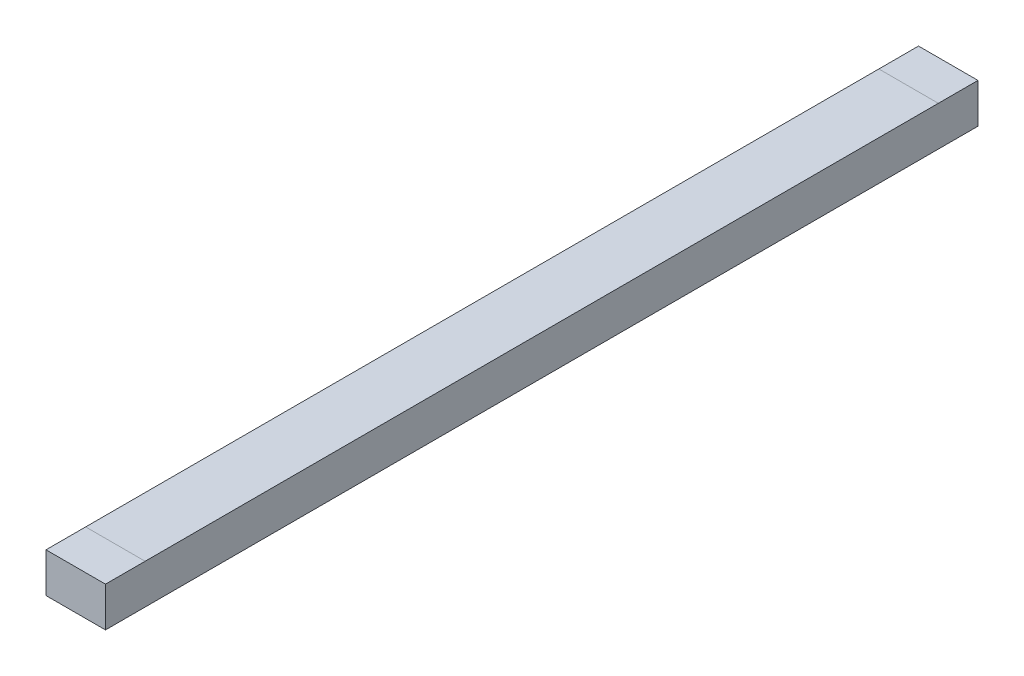
ISO-10303-21;
HEADER;
FILE_DESCRIPTION(('STEP AP214'),'2;1');
FILE_NAME('part.step','',(''),(''),'','','');
FILE_SCHEMA(('AUTOMOTIVE_DESIGN { 1 0 10303 214 1 1 1 1 }'));
ENDSEC;
DATA;
#1=APPLICATION_CONTEXT('core data for automotive mechanical design processes');
#2=APPLICATION_PROTOCOL_DEFINITION('international standard','automotive_design',2000,#1);
#3=PRODUCT_CONTEXT('',#1,'mechanical');
#4=PRODUCT('Part','Part','',(#3));
#5=PRODUCT_RELATED_PRODUCT_CATEGORY('part','',(#4));
#6=PRODUCT_DEFINITION_FORMATION('','',#4);
#7=PRODUCT_DEFINITION_CONTEXT('part definition',#1,'design');
#8=PRODUCT_DEFINITION('design','',#6,#7);
#9=PRODUCT_DEFINITION_SHAPE('','',#8);
#10=(LENGTH_UNIT() NAMED_UNIT(*) SI_UNIT(.MILLI.,.METRE.));
#11=(NAMED_UNIT(*) PLANE_ANGLE_UNIT() SI_UNIT($,.RADIAN.));
#12=(NAMED_UNIT(*) SI_UNIT($,.STERADIAN.) SOLID_ANGLE_UNIT());
#13=UNCERTAINTY_MEASURE_WITH_UNIT(LENGTH_MEASURE(1.E-05),#10,'distance_accuracy_value','');
#14=(GEOMETRIC_REPRESENTATION_CONTEXT(3) GLOBAL_UNCERTAINTY_ASSIGNED_CONTEXT((#13)) GLOBAL_UNIT_ASSIGNED_CONTEXT((#10,
#11,#12)) REPRESENTATION_CONTEXT('',''));
#15=CARTESIAN_POINT('',(0.,0.,0.));
#16=DIRECTION('',(0.,0.,1.));
#17=DIRECTION('',(1.,0.,0.));
#18=AXIS2_PLACEMENT_3D('',#15,#16,#17);
#19=CARTESIAN_POINT('',(0.,0.,2200.));
#20=DIRECTION('',(0.,1.,0.));
#21=DIRECTION('',(0.,0.,1.));
#22=AXIS2_PLACEMENT_3D('',#19,#20,#21);
#23=PLANE('',#22);
#24=DIRECTION('',(-1.,0.,0.));
#25=VECTOR('',#24,1.);
#26=CARTESIAN_POINT('',(0.,0.,2100.));
#27=LINE('',#26,#25);
#28=CARTESIAN_POINT('',(150.,0.,2100.));
#29=VERTEX_POINT('',#28);
#30=CARTESIAN_POINT('',(0.,0.,2100.));
#31=VERTEX_POINT('',#30);
#32=EDGE_CURVE('E12',#29,#31,#27,.T.);
#33=ORIENTED_EDGE('',*,*,#32,.F.);
#34=DIRECTION('',(0.,0.,-1.));
#35=VECTOR('',#34,1.);
#36=CARTESIAN_POINT('',(150.,0.,2200.));
#37=LINE('',#36,#35);
#38=CARTESIAN_POINT('',(150.,0.,2200.));
#39=VERTEX_POINT('',#38);
#40=EDGE_CURVE('E117',#39,#29,#37,.T.);
#41=ORIENTED_EDGE('',*,*,#40,.F.);
#42=DIRECTION('',(1.,0.,0.));
#43=VECTOR('',#42,1.);
#44=CARTESIAN_POINT('',(0.,0.,2200.));
#45=LINE('',#44,#43);
#46=CARTESIAN_POINT('',(0.,0.,2200.));
#47=VERTEX_POINT('',#46);
#48=EDGE_CURVE('E112',#47,#39,#45,.T.);
#49=ORIENTED_EDGE('',*,*,#48,.F.);
#50=DIRECTION('',(0.,0.,-1.));
#51=VECTOR('',#50,1.);
#52=CARTESIAN_POINT('',(0.,0.,2200.));
#53=LINE('',#52,#51);
#54=EDGE_CURVE('E115',#47,#31,#53,.T.);
#55=ORIENTED_EDGE('',*,*,#54,.T.);
#56=EDGE_LOOP('',(#33,#41,#49,#55));
#57=FACE_BOUND('',#56,.T.);
#58=ADVANCED_FACE('F52',(#57),#23,.F.);
#59=CARTESIAN_POINT('',(0.,100.,2200.));
#60=DIRECTION('',(0.,-1.,0.));
#61=DIRECTION('',(0.,0.,-1.));
#62=AXIS2_PLACEMENT_3D('',#59,#60,#61);
#63=PLANE('',#62);
#64=DIRECTION('',(1.,0.,0.));
#65=VECTOR('',#64,1.);
#66=CARTESIAN_POINT('',(0.,100.,2100.));
#67=LINE('',#66,#65);
#68=CARTESIAN_POINT('',(0.,100.,2100.));
#69=VERTEX_POINT('',#68);
#70=CARTESIAN_POINT('',(150.,100.,2100.));
#71=VERTEX_POINT('',#70);
#72=EDGE_CURVE('E56',#69,#71,#67,.T.);
#73=ORIENTED_EDGE('',*,*,#72,.F.);
#74=DIRECTION('',(0.,0.,-1.));
#75=VECTOR('',#74,1.);
#76=CARTESIAN_POINT('',(0.,100.,2200.));
#77=LINE('',#76,#75);
#78=CARTESIAN_POINT('',(0.,100.,2200.));
#79=VERTEX_POINT('',#78);
#80=EDGE_CURVE('E161',#79,#69,#77,.T.);
#81=ORIENTED_EDGE('',*,*,#80,.F.);
#82=DIRECTION('',(-1.,0.,0.));
#83=VECTOR('',#82,1.);
#84=CARTESIAN_POINT('',(0.,100.,2200.));
#85=LINE('',#84,#83);
#86=CARTESIAN_POINT('',(150.,100.,2200.));
#87=VERTEX_POINT('',#86);
#88=EDGE_CURVE('E126',#87,#79,#85,.T.);
#89=ORIENTED_EDGE('',*,*,#88,.F.);
#90=DIRECTION('',(0.,0.,-1.));
#91=VECTOR('',#90,1.);
#92=CARTESIAN_POINT('',(150.,100.,2200.));
#93=LINE('',#92,#91);
#94=EDGE_CURVE('E152',#87,#71,#93,.T.);
#95=ORIENTED_EDGE('',*,*,#94,.T.);
#96=EDGE_LOOP('',(#73,#81,#89,#95));
#97=FACE_BOUND('',#96,.T.);
#98=ADVANCED_FACE('F199',(#97),#63,.F.);
#99=CARTESIAN_POINT('',(150.,0.,100.));
#100=VERTEX_POINT('',#99);
#101=EDGE_CURVE('E148',#29,#100,#37,.T.);
#102=ORIENTED_EDGE('',*,*,#101,.F.);
#103=ORIENTED_EDGE('',*,*,#32,.T.);
#104=CARTESIAN_POINT('',(0.,0.,100.));
#105=VERTEX_POINT('',#104);
#106=EDGE_CURVE('E134',#31,#105,#53,.T.);
#107=ORIENTED_EDGE('',*,*,#106,.T.);
#108=DIRECTION('',(-1.,0.,0.));
#109=VECTOR('',#108,1.);
#110=CARTESIAN_POINT('',(0.,0.,100.));
#111=LINE('',#110,#109);
#112=EDGE_CURVE('E140',#100,#105,#111,.T.);
#113=ORIENTED_EDGE('',*,*,#112,.F.);
#114=EDGE_LOOP('',(#102,#103,#107,#113));
#115=FACE_BOUND('',#114,.T.);
#116=ADVANCED_FACE('F201',(#115),#23,.F.);
#117=CARTESIAN_POINT('',(0.,100.,100.));
#118=VERTEX_POINT('',#117);
#119=EDGE_CURVE('E165',#69,#118,#77,.T.);
#120=ORIENTED_EDGE('',*,*,#119,.F.);
#121=ORIENTED_EDGE('',*,*,#72,.T.);
#122=CARTESIAN_POINT('',(150.,100.,100.));
#123=VERTEX_POINT('',#122);
#124=EDGE_CURVE('E156',#71,#123,#93,.T.);
#125=ORIENTED_EDGE('',*,*,#124,.T.);
#126=DIRECTION('',(1.,0.,0.));
#127=VECTOR('',#126,1.);
#128=CARTESIAN_POINT('',(0.,100.,100.));
#129=LINE('',#128,#127);
#130=EDGE_CURVE('E135',#118,#123,#129,.T.);
#131=ORIENTED_EDGE('',*,*,#130,.F.);
#132=EDGE_LOOP('',(#120,#121,#125,#131));
#133=FACE_BOUND('',#132,.T.);
#134=ADVANCED_FACE('F196',(#133),#63,.F.);
#135=CARTESIAN_POINT('',(0.,0.,2200.));
#136=DIRECTION('',(1.,0.,0.));
#137=DIRECTION('',(0.,0.,-1.));
#138=AXIS2_PLACEMENT_3D('',#135,#136,#137);
#139=PLANE('',#138);
#140=DIRECTION('',(0.,-1.,0.));
#141=VECTOR('',#140,1.);
#142=CARTESIAN_POINT('',(0.,0.,0.));
#143=LINE('',#142,#141);
#144=CARTESIAN_POINT('',(0.,100.,0.));
#145=VERTEX_POINT('',#144);
#146=CARTESIAN_POINT('',(0.,0.,0.));
#147=VERTEX_POINT('',#146);
#148=EDGE_CURVE('E172',#145,#147,#143,.T.);
#149=ORIENTED_EDGE('',*,*,#148,.T.);
#150=EDGE_CURVE('E137',#105,#147,#53,.T.);
#151=ORIENTED_EDGE('',*,*,#150,.F.);
#152=ORIENTED_EDGE('',*,*,#106,.F.);
#153=ORIENTED_EDGE('',*,*,#54,.F.);
#154=DIRECTION('',(0.,-1.,0.));
#155=VECTOR('',#154,1.);
#156=CARTESIAN_POINT('',(0.,0.,2200.));
#157=LINE('',#156,#155);
#158=EDGE_CURVE('E121',#79,#47,#157,.T.);
#159=ORIENTED_EDGE('',*,*,#158,.F.);
#160=ORIENTED_EDGE('',*,*,#80,.T.);
#161=ORIENTED_EDGE('',*,*,#119,.T.);
#162=EDGE_CURVE('E166',#118,#145,#77,.T.);
#163=ORIENTED_EDGE('',*,*,#162,.T.);
#164=EDGE_LOOP('',(#149,#151,#152,#153,#159,#160,#161,#163));
#165=FACE_BOUND('',#164,.T.);
#166=ADVANCED_FACE('F54',(#165),#139,.F.);
#167=CARTESIAN_POINT('',(150.,0.,0.));
#168=VERTEX_POINT('',#167);
#169=EDGE_CURVE('E149',#100,#168,#37,.T.);
#170=ORIENTED_EDGE('',*,*,#169,.F.);
#171=ORIENTED_EDGE('',*,*,#112,.T.);
#172=ORIENTED_EDGE('',*,*,#150,.T.);
#173=DIRECTION('',(1.,0.,0.));
#174=VECTOR('',#173,1.);
#175=CARTESIAN_POINT('',(0.,0.,0.));
#176=LINE('',#175,#174);
#177=EDGE_CURVE('E174',#147,#168,#176,.T.);
#178=ORIENTED_EDGE('',*,*,#177,.T.);
#179=EDGE_LOOP('',(#170,#171,#172,#178));
#180=FACE_BOUND('',#179,.T.);
#181=ADVANCED_FACE('F183',(#180),#23,.F.);
#182=CARTESIAN_POINT('',(150.,0.,2200.));
#183=DIRECTION('',(-1.,0.,0.));
#184=DIRECTION('',(0.,0.,1.));
#185=AXIS2_PLACEMENT_3D('',#182,#183,#184);
#186=PLANE('',#185);
#187=DIRECTION('',(0.,1.,0.));
#188=VECTOR('',#187,1.);
#189=CARTESIAN_POINT('',(150.,0.,0.));
#190=LINE('',#189,#188);
#191=CARTESIAN_POINT('',(150.,100.,0.));
#192=VERTEX_POINT('',#191);
#193=EDGE_CURVE('E176',#168,#192,#190,.T.);
#194=ORIENTED_EDGE('',*,*,#193,.T.);
#195=EDGE_CURVE('E157',#123,#192,#93,.T.);
#196=ORIENTED_EDGE('',*,*,#195,.F.);
#197=ORIENTED_EDGE('',*,*,#124,.F.);
#198=ORIENTED_EDGE('',*,*,#94,.F.);
#199=DIRECTION('',(0.,1.,0.));
#200=VECTOR('',#199,1.);
#201=CARTESIAN_POINT('',(150.,0.,2200.));
#202=LINE('',#201,#200);
#203=EDGE_CURVE('E120',#39,#87,#202,.T.);
#204=ORIENTED_EDGE('',*,*,#203,.F.);
#205=ORIENTED_EDGE('',*,*,#40,.T.);
#206=ORIENTED_EDGE('',*,*,#101,.T.);
#207=ORIENTED_EDGE('',*,*,#169,.T.);
#208=EDGE_LOOP('',(#194,#196,#197,#198,#204,#205,#206,#207));
#209=FACE_BOUND('',#208,.T.);
#210=ADVANCED_FACE('F198',(#209),#186,.F.);
#211=ORIENTED_EDGE('',*,*,#162,.F.);
#212=ORIENTED_EDGE('',*,*,#130,.T.);
#213=ORIENTED_EDGE('',*,*,#195,.T.);
#214=DIRECTION('',(-1.,0.,0.));
#215=VECTOR('',#214,1.);
#216=CARTESIAN_POINT('',(0.,100.,0.));
#217=LINE('',#216,#215);
#218=EDGE_CURVE('E131',#192,#145,#217,.T.);
#219=ORIENTED_EDGE('',*,*,#218,.T.);
#220=EDGE_LOOP('',(#211,#212,#213,#219));
#221=FACE_BOUND('',#220,.T.);
#222=ADVANCED_FACE('F179',(#221),#63,.F.);
#223=CARTESIAN_POINT('',(0.,0.,2200.));
#224=DIRECTION('',(0.,0.,-1.));
#225=DIRECTION('',(-1.,0.,0.));
#226=AXIS2_PLACEMENT_3D('',#223,#224,#225);
#227=PLANE('',#226);
#228=ORIENTED_EDGE('',*,*,#158,.T.);
#229=ORIENTED_EDGE('',*,*,#48,.T.);
#230=ORIENTED_EDGE('',*,*,#203,.T.);
#231=ORIENTED_EDGE('',*,*,#88,.T.);
#232=EDGE_LOOP('',(#228,#229,#230,#231));
#233=FACE_BOUND('',#232,.T.);
#234=ADVANCED_FACE('F124',(#233),#227,.F.);
#235=CARTESIAN_POINT('',(0.,0.,0.));
#236=DIRECTION('',(0.,0.,-1.));
#237=DIRECTION('',(-1.,0.,0.));
#238=AXIS2_PLACEMENT_3D('',#235,#236,#237);
#239=PLANE('',#238);
#240=ORIENTED_EDGE('',*,*,#148,.F.);
#241=ORIENTED_EDGE('',*,*,#218,.F.);
#242=ORIENTED_EDGE('',*,*,#193,.F.);
#243=ORIENTED_EDGE('',*,*,#177,.F.);
#244=EDGE_LOOP('',(#240,#241,#242,#243));
#245=FACE_BOUND('',#244,.T.);
#246=ADVANCED_FACE('F182',(#245),#239,.T.);
#247=CLOSED_SHELL('',(#58,#98,#116,#134,#166,#181,#210,#222,#234,#246));
#248=MANIFOLD_SOLID_BREP('B2',#247);
#249=ADVANCED_BREP_SHAPE_REPRESENTATION('',(#18,#248),#14);
#250=SHAPE_DEFINITION_REPRESENTATION(#9,#249);
ENDSEC;
END-ISO-10303-21;
